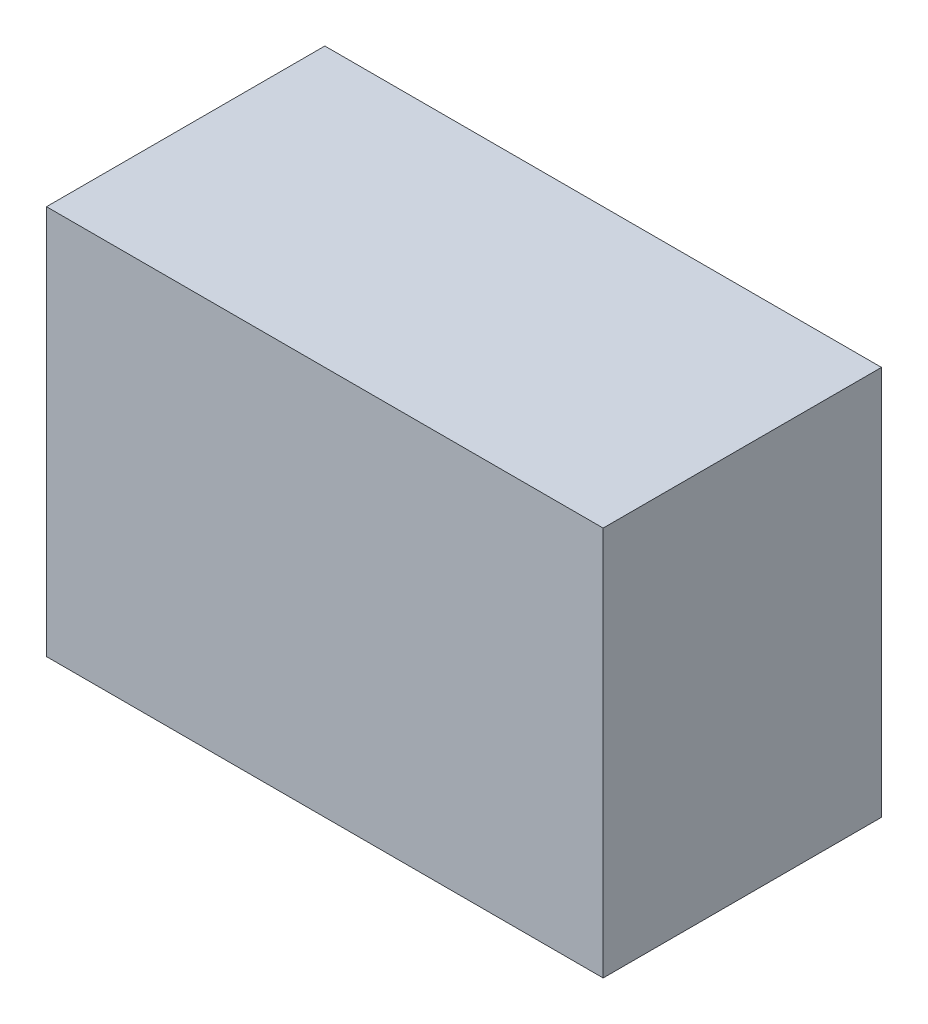
ISO-10303-21;
HEADER;
FILE_DESCRIPTION(('STEP AP214'),'2;1');
FILE_NAME('part.step','',(''),(''),'','','');
FILE_SCHEMA(('AUTOMOTIVE_DESIGN { 1 0 10303 214 1 1 1 1 }'));
ENDSEC;
DATA;
#1=APPLICATION_CONTEXT('core data for automotive mechanical design processes');
#2=APPLICATION_PROTOCOL_DEFINITION('international standard','automotive_design',2000,#1);
#3=PRODUCT_CONTEXT('',#1,'mechanical');
#4=PRODUCT('Part','Part','',(#3));
#5=PRODUCT_RELATED_PRODUCT_CATEGORY('part','',(#4));
#6=PRODUCT_DEFINITION_FORMATION('','',#4);
#7=PRODUCT_DEFINITION_CONTEXT('part definition',#1,'design');
#8=PRODUCT_DEFINITION('design','',#6,#7);
#9=PRODUCT_DEFINITION_SHAPE('','',#8);
#10=(LENGTH_UNIT() NAMED_UNIT(*) SI_UNIT(.MILLI.,.METRE.));
#11=(NAMED_UNIT(*) PLANE_ANGLE_UNIT() SI_UNIT($,.RADIAN.));
#12=(NAMED_UNIT(*) SI_UNIT($,.STERADIAN.) SOLID_ANGLE_UNIT());
#13=UNCERTAINTY_MEASURE_WITH_UNIT(LENGTH_MEASURE(1.E-05),#10,'distance_accuracy_value','');
#14=(GEOMETRIC_REPRESENTATION_CONTEXT(3) GLOBAL_UNCERTAINTY_ASSIGNED_CONTEXT((#13)) GLOBAL_UNIT_ASSIGNED_CONTEXT((#10,
#11,#12)) REPRESENTATION_CONTEXT('',''));
#15=CARTESIAN_POINT('',(0.,0.,0.));
#16=DIRECTION('',(0.,0.,1.));
#17=DIRECTION('',(1.,0.,0.));
#18=AXIS2_PLACEMENT_3D('',#15,#16,#17);
#19=CARTESIAN_POINT('',(50.,-35.,50.));
#20=DIRECTION('',(-1.,0.,0.));
#21=DIRECTION('',(0.,0.,1.));
#22=AXIS2_PLACEMENT_3D('',#19,#20,#21);
#23=PLANE('',#22);
#24=DIRECTION('',(0.,1.,0.));
#25=VECTOR('',#24,1.);
#26=CARTESIAN_POINT('',(50.,-35.,0.));
#27=LINE('',#26,#25);
#28=CARTESIAN_POINT('',(50.,-35.,0.));
#29=VERTEX_POINT('',#28);
#30=CARTESIAN_POINT('',(50.,35.,0.));
#31=VERTEX_POINT('',#30);
#32=EDGE_CURVE('E113',#29,#31,#27,.T.);
#33=ORIENTED_EDGE('',*,*,#32,.T.);
#34=DIRECTION('',(0.,0.,-1.));
#35=VECTOR('',#34,1.);
#36=CARTESIAN_POINT('',(50.,35.,50.));
#37=LINE('',#36,#35);
#38=CARTESIAN_POINT('',(50.,35.,50.));
#39=VERTEX_POINT('',#38);
#40=EDGE_CURVE('E11',#39,#31,#37,.T.);
#41=ORIENTED_EDGE('',*,*,#40,.F.);
#42=DIRECTION('',(0.,1.,0.));
#43=VECTOR('',#42,1.);
#44=CARTESIAN_POINT('',(50.,-35.,50.));
#45=LINE('',#44,#43);
#46=CARTESIAN_POINT('',(50.,-35.,50.));
#47=VERTEX_POINT('',#46);
#48=EDGE_CURVE('E97',#47,#39,#45,.T.);
#49=ORIENTED_EDGE('',*,*,#48,.F.);
#50=DIRECTION('',(0.,0.,-1.));
#51=VECTOR('',#50,1.);
#52=CARTESIAN_POINT('',(50.,-35.,50.));
#53=LINE('',#52,#51);
#54=EDGE_CURVE('E109',#47,#29,#53,.T.);
#55=ORIENTED_EDGE('',*,*,#54,.T.);
#56=EDGE_LOOP('',(#33,#41,#49,#55));
#57=FACE_BOUND('',#56,.T.);
#58=ADVANCED_FACE('F45',(#57),#23,.F.);
#59=CARTESIAN_POINT('',(-50.,35.,50.));
#60=DIRECTION('',(0.,-1.,0.));
#61=DIRECTION('',(0.,0.,-1.));
#62=AXIS2_PLACEMENT_3D('',#59,#60,#61);
#63=PLANE('',#62);
#64=DIRECTION('',(-1.,0.,0.));
#65=VECTOR('',#64,1.);
#66=CARTESIAN_POINT('',(-50.,35.,0.));
#67=LINE('',#66,#65);
#68=CARTESIAN_POINT('',(-50.,35.,0.));
#69=VERTEX_POINT('',#68);
#70=EDGE_CURVE('E102',#31,#69,#67,.T.);
#71=ORIENTED_EDGE('',*,*,#70,.T.);
#72=DIRECTION('',(0.,0.,-1.));
#73=VECTOR('',#72,1.);
#74=CARTESIAN_POINT('',(-50.,35.,50.));
#75=LINE('',#74,#73);
#76=CARTESIAN_POINT('',(-50.,35.,50.));
#77=VERTEX_POINT('',#76);
#78=EDGE_CURVE('E54',#77,#69,#75,.T.);
#79=ORIENTED_EDGE('',*,*,#78,.F.);
#80=DIRECTION('',(-1.,0.,0.));
#81=VECTOR('',#80,1.);
#82=CARTESIAN_POINT('',(-50.,35.,50.));
#83=LINE('',#82,#81);
#84=EDGE_CURVE('E92',#39,#77,#83,.T.);
#85=ORIENTED_EDGE('',*,*,#84,.F.);
#86=ORIENTED_EDGE('',*,*,#40,.T.);
#87=EDGE_LOOP('',(#71,#79,#85,#86));
#88=FACE_BOUND('',#87,.T.);
#89=ADVANCED_FACE('F101',(#88),#63,.F.);
#90=CARTESIAN_POINT('',(-50.,-35.,50.));
#91=DIRECTION('',(1.,0.,0.));
#92=DIRECTION('',(0.,0.,-1.));
#93=AXIS2_PLACEMENT_3D('',#90,#91,#92);
#94=PLANE('',#93);
#95=DIRECTION('',(0.,-1.,0.));
#96=VECTOR('',#95,1.);
#97=CARTESIAN_POINT('',(-50.,-35.,0.));
#98=LINE('',#97,#96);
#99=CARTESIAN_POINT('',(-50.,-35.,0.));
#100=VERTEX_POINT('',#99);
#101=EDGE_CURVE('E79',#69,#100,#98,.T.);
#102=ORIENTED_EDGE('',*,*,#101,.T.);
#103=DIRECTION('',(0.,0.,-1.));
#104=VECTOR('',#103,1.);
#105=CARTESIAN_POINT('',(-50.,-35.,50.));
#106=LINE('',#105,#104);
#107=CARTESIAN_POINT('',(-50.,-35.,50.));
#108=VERTEX_POINT('',#107);
#109=EDGE_CURVE('E104',#108,#100,#106,.T.);
#110=ORIENTED_EDGE('',*,*,#109,.F.);
#111=DIRECTION('',(0.,-1.,0.));
#112=VECTOR('',#111,1.);
#113=CARTESIAN_POINT('',(-50.,-35.,50.));
#114=LINE('',#113,#112);
#115=EDGE_CURVE('E95',#77,#108,#114,.T.);
#116=ORIENTED_EDGE('',*,*,#115,.F.);
#117=ORIENTED_EDGE('',*,*,#78,.T.);
#118=EDGE_LOOP('',(#102,#110,#116,#117));
#119=FACE_BOUND('',#118,.T.);
#120=ADVANCED_FACE('F105',(#119),#94,.F.);
#121=CARTESIAN_POINT('',(-50.,-35.,50.));
#122=DIRECTION('',(0.,1.,0.));
#123=DIRECTION('',(0.,0.,1.));
#124=AXIS2_PLACEMENT_3D('',#121,#122,#123);
#125=PLANE('',#124);
#126=DIRECTION('',(1.,0.,0.));
#127=VECTOR('',#126,1.);
#128=CARTESIAN_POINT('',(-50.,-35.,0.));
#129=LINE('',#128,#127);
#130=EDGE_CURVE('E85',#100,#29,#129,.T.);
#131=ORIENTED_EDGE('',*,*,#130,.T.);
#132=ORIENTED_EDGE('',*,*,#54,.F.);
#133=DIRECTION('',(1.,0.,0.));
#134=VECTOR('',#133,1.);
#135=CARTESIAN_POINT('',(-50.,-35.,50.));
#136=LINE('',#135,#134);
#137=EDGE_CURVE('E62',#108,#47,#136,.T.);
#138=ORIENTED_EDGE('',*,*,#137,.F.);
#139=ORIENTED_EDGE('',*,*,#109,.T.);
#140=EDGE_LOOP('',(#131,#132,#138,#139));
#141=FACE_BOUND('',#140,.T.);
#142=ADVANCED_FACE('F126',(#141),#125,.F.);
#143=CARTESIAN_POINT('',(0.,0.,50.));
#144=DIRECTION('',(0.,0.,-1.));
#145=DIRECTION('',(-1.,0.,0.));
#146=AXIS2_PLACEMENT_3D('',#143,#144,#145);
#147=PLANE('',#146);
#148=ORIENTED_EDGE('',*,*,#48,.T.);
#149=ORIENTED_EDGE('',*,*,#84,.T.);
#150=ORIENTED_EDGE('',*,*,#115,.T.);
#151=ORIENTED_EDGE('',*,*,#137,.T.);
#152=EDGE_LOOP('',(#148,#149,#150,#151));
#153=FACE_BOUND('',#152,.T.);
#154=ADVANCED_FACE('F93',(#153),#147,.F.);
#155=CARTESIAN_POINT('',(0.,0.,0.));
#156=DIRECTION('',(0.,0.,-1.));
#157=DIRECTION('',(-1.,0.,0.));
#158=AXIS2_PLACEMENT_3D('',#155,#156,#157);
#159=PLANE('',#158);
#160=ORIENTED_EDGE('',*,*,#32,.F.);
#161=ORIENTED_EDGE('',*,*,#130,.F.);
#162=ORIENTED_EDGE('',*,*,#101,.F.);
#163=ORIENTED_EDGE('',*,*,#70,.F.);
#164=EDGE_LOOP('',(#160,#161,#162,#163));
#165=FACE_BOUND('',#164,.T.);
#166=ADVANCED_FACE('F129',(#165),#159,.T.);
#167=CLOSED_SHELL('',(#58,#89,#120,#142,#154,#166));
#168=MANIFOLD_SOLID_BREP('B2',#167);
#169=ADVANCED_BREP_SHAPE_REPRESENTATION('',(#18,#168),#14);
#170=SHAPE_DEFINITION_REPRESENTATION(#9,#169);
ENDSEC;
END-ISO-10303-21;
